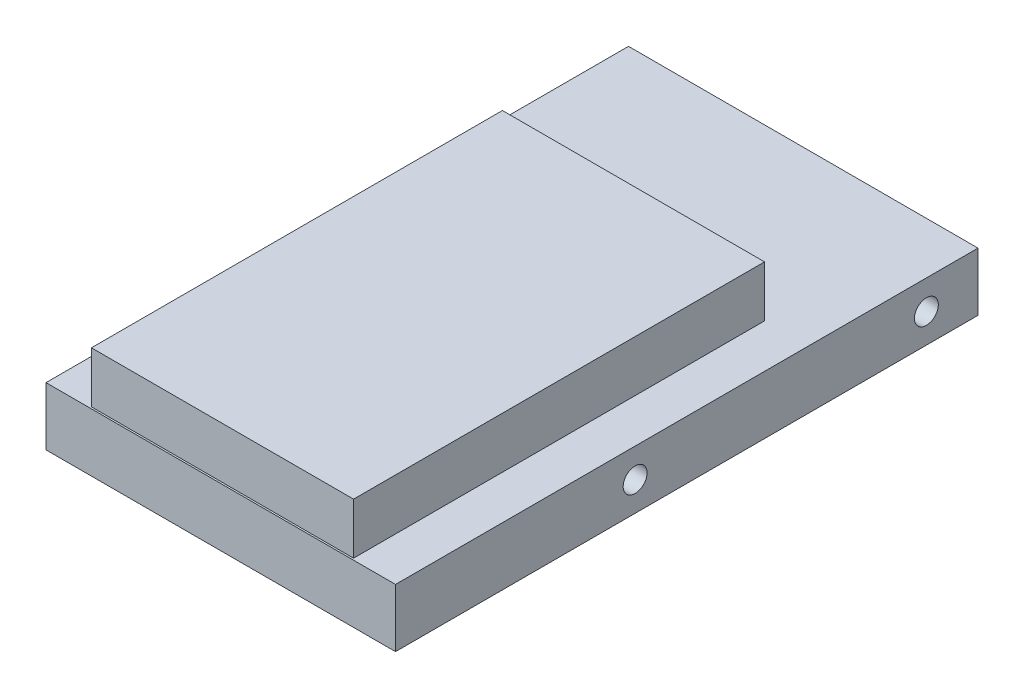
ISO-10303-21;
HEADER;
FILE_DESCRIPTION(('STEP AP214'),'2;1');
FILE_NAME('part.step','',(''),(''),'','','');
FILE_SCHEMA(('AUTOMOTIVE_DESIGN { 1 0 10303 214 1 1 1 1 }'));
ENDSEC;
DATA;
#1=APPLICATION_CONTEXT('core data for automotive mechanical design processes');
#2=APPLICATION_PROTOCOL_DEFINITION('international standard','automotive_design',2000,#1);
#3=PRODUCT_CONTEXT('',#1,'mechanical');
#4=PRODUCT('Part','Part','',(#3));
#5=PRODUCT_RELATED_PRODUCT_CATEGORY('part','',(#4));
#6=PRODUCT_DEFINITION_FORMATION('','',#4);
#7=PRODUCT_DEFINITION_CONTEXT('part definition',#1,'design');
#8=PRODUCT_DEFINITION('design','',#6,#7);
#9=PRODUCT_DEFINITION_SHAPE('','',#8);
#10=(LENGTH_UNIT() NAMED_UNIT(*) SI_UNIT(.MILLI.,.METRE.));
#11=(NAMED_UNIT(*) PLANE_ANGLE_UNIT() SI_UNIT($,.RADIAN.));
#12=(NAMED_UNIT(*) SI_UNIT($,.STERADIAN.) SOLID_ANGLE_UNIT());
#13=UNCERTAINTY_MEASURE_WITH_UNIT(LENGTH_MEASURE(1.E-05),#10,'distance_accuracy_value','');
#14=(GEOMETRIC_REPRESENTATION_CONTEXT(3) GLOBAL_UNCERTAINTY_ASSIGNED_CONTEXT((#13)) GLOBAL_UNIT_ASSIGNED_CONTEXT((#10,
#11,#12)) REPRESENTATION_CONTEXT('',''));
#15=CARTESIAN_POINT('',(0.,0.,0.));
#16=DIRECTION('',(0.,0.,1.));
#17=DIRECTION('',(1.,0.,0.));
#18=AXIS2_PLACEMENT_3D('',#15,#16,#17);
#19=CARTESIAN_POINT('',(30.,10.,0.));
#20=DIRECTION('',(0.,-1.,0.));
#21=DIRECTION('',(0.,0.,-1.));
#22=AXIS2_PLACEMENT_3D('',#19,#20,#21);
#23=PLANE('',#22);
#24=DIRECTION('',(0.,0.,1.));
#25=VECTOR('',#24,1.);
#26=CARTESIAN_POINT('',(-30.,10.,0.));
#27=LINE('',#26,#25);
#28=CARTESIAN_POINT('',(-30.,10.,-100.));
#29=VERTEX_POINT('',#28);
#30=CARTESIAN_POINT('',(-30.,10.,0.));
#31=VERTEX_POINT('',#30);
#32=EDGE_CURVE('E78',#29,#31,#27,.T.);
#33=ORIENTED_EDGE('',*,*,#32,.T.);
#34=DIRECTION('',(-1.,0.,0.));
#35=VECTOR('',#34,1.);
#36=CARTESIAN_POINT('',(30.,10.,0.));
#37=LINE('',#36,#35);
#38=CARTESIAN_POINT('',(30.,10.,0.));
#39=VERTEX_POINT('',#38);
#40=EDGE_CURVE('E165',#39,#31,#37,.T.);
#41=ORIENTED_EDGE('',*,*,#40,.F.);
#42=DIRECTION('',(0.,0.,1.));
#43=VECTOR('',#42,1.);
#44=CARTESIAN_POINT('',(30.,10.,0.));
#45=LINE('',#44,#43);
#46=CARTESIAN_POINT('',(30.,10.,-100.));
#47=VERTEX_POINT('',#46);
#48=EDGE_CURVE('E57',#47,#39,#45,.T.);
#49=ORIENTED_EDGE('',*,*,#48,.F.);
#50=DIRECTION('',(-1.,0.,0.));
#51=VECTOR('',#50,1.);
#52=CARTESIAN_POINT('',(30.,10.,-100.));
#53=LINE('',#52,#51);
#54=EDGE_CURVE('E174',#47,#29,#53,.T.);
#55=ORIENTED_EDGE('',*,*,#54,.T.);
#56=EDGE_LOOP('',(#33,#41,#49,#55));
#57=FACE_BOUND('',#56,.T.);
#58=DIRECTION('',(0.,0.,-1.));
#59=VECTOR('',#58,1.);
#60=CARTESIAN_POINT('',(22.5,10.,-0.300388826904058));
#61=LINE('',#60,#59);
#62=CARTESIAN_POINT('',(22.5,10.,-0.300388826904058));
#63=VERTEX_POINT('',#62);
#64=CARTESIAN_POINT('',(22.5,10.,-70.8527289797882));
#65=VERTEX_POINT('',#64);
#66=EDGE_CURVE('E110',#63,#65,#61,.T.);
#67=ORIENTED_EDGE('',*,*,#66,.F.);
#68=DIRECTION('',(-1.,0.,0.));
#69=VECTOR('',#68,1.);
#70=CARTESIAN_POINT('',(22.5,10.,-0.300388826904058));
#71=LINE('',#70,#69);
#72=CARTESIAN_POINT('',(-22.5,10.,-0.300388826904058));
#73=VERTEX_POINT('',#72);
#74=EDGE_CURVE('E121',#63,#73,#71,.T.);
#75=ORIENTED_EDGE('',*,*,#74,.T.);
#76=DIRECTION('',(0.,0.,-1.));
#77=VECTOR('',#76,1.);
#78=CARTESIAN_POINT('',(-22.5,10.,-0.300388826904058));
#79=LINE('',#78,#77);
#80=CARTESIAN_POINT('',(-22.5,10.,-70.8527289797882));
#81=VERTEX_POINT('',#80);
#82=EDGE_CURVE('E138',#73,#81,#79,.T.);
#83=ORIENTED_EDGE('',*,*,#82,.T.);
#84=DIRECTION('',(-1.,0.,0.));
#85=VECTOR('',#84,1.);
#86=CARTESIAN_POINT('',(22.5,10.,-70.8527289797882));
#87=LINE('',#86,#85);
#88=EDGE_CURVE('E128',#65,#81,#87,.T.);
#89=ORIENTED_EDGE('',*,*,#88,.F.);
#90=EDGE_LOOP('',(#67,#75,#83,#89));
#91=FACE_BOUND('',#90,.T.);
#92=ADVANCED_FACE('F33',(#57,#91),#23,.F.);
#93=CARTESIAN_POINT('',(30.,0.,0.));
#94=DIRECTION('',(0.,0.,-1.));
#95=DIRECTION('',(-1.,0.,0.));
#96=AXIS2_PLACEMENT_3D('',#93,#94,#95);
#97=PLANE('',#96);
#98=DIRECTION('',(0.,-1.,0.));
#99=VECTOR('',#98,1.);
#100=CARTESIAN_POINT('',(-30.,0.,0.));
#101=LINE('',#100,#99);
#102=CARTESIAN_POINT('',(-30.,0.,0.));
#103=VERTEX_POINT('',#102);
#104=EDGE_CURVE('E158',#31,#103,#101,.T.);
#105=ORIENTED_EDGE('',*,*,#104,.T.);
#106=DIRECTION('',(-1.,0.,0.));
#107=VECTOR('',#106,1.);
#108=CARTESIAN_POINT('',(30.,0.,0.));
#109=LINE('',#108,#107);
#110=CARTESIAN_POINT('',(30.,0.,0.));
#111=VERTEX_POINT('',#110);
#112=EDGE_CURVE('E11',#111,#103,#109,.T.);
#113=ORIENTED_EDGE('',*,*,#112,.F.);
#114=DIRECTION('',(0.,-1.,0.));
#115=VECTOR('',#114,1.);
#116=CARTESIAN_POINT('',(30.,0.,0.));
#117=LINE('',#116,#115);
#118=EDGE_CURVE('E159',#39,#111,#117,.T.);
#119=ORIENTED_EDGE('',*,*,#118,.F.);
#120=ORIENTED_EDGE('',*,*,#40,.T.);
#121=EDGE_LOOP('',(#105,#113,#119,#120));
#122=FACE_BOUND('',#121,.T.);
#123=ADVANCED_FACE('F35',(#122),#97,.F.);
#124=CARTESIAN_POINT('',(30.,0.,0.));
#125=DIRECTION('',(0.,1.,0.));
#126=DIRECTION('',(0.,0.,1.));
#127=AXIS2_PLACEMENT_3D('',#124,#125,#126);
#128=PLANE('',#127);
#129=DIRECTION('',(0.,0.,-1.));
#130=VECTOR('',#129,1.);
#131=CARTESIAN_POINT('',(-30.,0.,0.));
#132=LINE('',#131,#130);
#133=CARTESIAN_POINT('',(-30.,0.,-100.));
#134=VERTEX_POINT('',#133);
#135=EDGE_CURVE('E168',#103,#134,#132,.T.);
#136=ORIENTED_EDGE('',*,*,#135,.T.);
#137=DIRECTION('',(-1.,0.,0.));
#138=VECTOR('',#137,1.);
#139=CARTESIAN_POINT('',(30.,0.,-100.));
#140=LINE('',#139,#138);
#141=CARTESIAN_POINT('',(30.,0.,-100.));
#142=VERTEX_POINT('',#141);
#143=EDGE_CURVE('E41',#142,#134,#140,.T.);
#144=ORIENTED_EDGE('',*,*,#143,.F.);
#145=DIRECTION('',(0.,0.,-1.));
#146=VECTOR('',#145,1.);
#147=CARTESIAN_POINT('',(30.,0.,0.));
#148=LINE('',#147,#146);
#149=EDGE_CURVE('E85',#111,#142,#148,.T.);
#150=ORIENTED_EDGE('',*,*,#149,.F.);
#151=ORIENTED_EDGE('',*,*,#112,.T.);
#152=EDGE_LOOP('',(#136,#144,#150,#151));
#153=FACE_BOUND('',#152,.T.);
#154=ADVANCED_FACE('F192',(#153),#128,.F.);
#155=CARTESIAN_POINT('',(30.,0.,-100.));
#156=DIRECTION('',(0.,0.,1.));
#157=DIRECTION('',(1.,0.,0.));
#158=AXIS2_PLACEMENT_3D('',#155,#156,#157);
#159=PLANE('',#158);
#160=DIRECTION('',(0.,1.,0.));
#161=VECTOR('',#160,1.);
#162=CARTESIAN_POINT('',(-30.,0.,-100.));
#163=LINE('',#162,#161);
#164=EDGE_CURVE('E170',#134,#29,#163,.T.);
#165=ORIENTED_EDGE('',*,*,#164,.T.);
#166=ORIENTED_EDGE('',*,*,#54,.F.);
#167=DIRECTION('',(0.,1.,0.));
#168=VECTOR('',#167,1.);
#169=CARTESIAN_POINT('',(30.,0.,-100.));
#170=LINE('',#169,#168);
#171=EDGE_CURVE('E162',#142,#47,#170,.T.);
#172=ORIENTED_EDGE('',*,*,#171,.F.);
#173=ORIENTED_EDGE('',*,*,#143,.T.);
#174=EDGE_LOOP('',(#165,#166,#172,#173));
#175=FACE_BOUND('',#174,.T.);
#176=ADVANCED_FACE('F179',(#175),#159,.F.);
#177=CARTESIAN_POINT('',(30.,0.,0.));
#178=DIRECTION('',(-1.,0.,0.));
#179=DIRECTION('',(0.,0.,1.));
#180=AXIS2_PLACEMENT_3D('',#177,#178,#179);
#181=PLANE('',#180);
#182=CARTESIAN_POINT('',(30.,5.,-91.1379551694327));
#183=DIRECTION('',(1.,0.,0.));
#184=DIRECTION('',(0.,0.,-1.));
#185=AXIS2_PLACEMENT_3D('',#182,#183,#184);
#186=CIRCLE('',#185,2.04999999999999);
#187=CARTESIAN_POINT('',(30.,5.,-93.1879551694327));
#188=VERTEX_POINT('',#187);
#189=EDGE_CURVE('E127',#188,#188,#186,.T.);
#190=ORIENTED_EDGE('',*,*,#189,.F.);
#191=EDGE_LOOP('',(#190));
#192=FACE_BOUND('',#191,.T.);
#193=CARTESIAN_POINT('',(30.,5.,-41.1379551694327));
#194=DIRECTION('',(1.,0.,0.));
#195=DIRECTION('',(0.,0.,-1.));
#196=AXIS2_PLACEMENT_3D('',#193,#194,#195);
#197=CIRCLE('',#196,2.05);
#198=CARTESIAN_POINT('',(30.,5.,-43.1879551694327));
#199=VERTEX_POINT('',#198);
#200=EDGE_CURVE('E152',#199,#199,#197,.T.);
#201=ORIENTED_EDGE('',*,*,#200,.F.);
#202=EDGE_LOOP('',(#201));
#203=FACE_BOUND('',#202,.T.);
#204=ORIENTED_EDGE('',*,*,#118,.T.);
#205=ORIENTED_EDGE('',*,*,#149,.T.);
#206=ORIENTED_EDGE('',*,*,#171,.T.);
#207=ORIENTED_EDGE('',*,*,#48,.T.);
#208=EDGE_LOOP('',(#204,#205,#206,#207));
#209=FACE_BOUND('',#208,.T.);
#210=ADVANCED_FACE('F197',(#192,#203,#209),#181,.F.);
#211=CARTESIAN_POINT('',(-30.,0.,0.));
#212=DIRECTION('',(-1.,0.,0.));
#213=DIRECTION('',(0.,0.,1.));
#214=AXIS2_PLACEMENT_3D('',#211,#212,#213);
#215=PLANE('',#214);
#216=CARTESIAN_POINT('',(-30.,5.,-91.1379551694327));
#217=DIRECTION('',(1.,0.,0.));
#218=DIRECTION('',(0.,0.,-1.));
#219=AXIS2_PLACEMENT_3D('',#216,#217,#218);
#220=CIRCLE('',#219,2.04999999999999);
#221=CARTESIAN_POINT('',(-30.,5.,-93.1879551694327));
#222=VERTEX_POINT('',#221);
#223=EDGE_CURVE('E149',#222,#222,#220,.T.);
#224=ORIENTED_EDGE('',*,*,#223,.T.);
#225=EDGE_LOOP('',(#224));
#226=FACE_BOUND('',#225,.T.);
#227=CARTESIAN_POINT('',(-30.,5.,-41.1379551694327));
#228=DIRECTION('',(1.,0.,0.));
#229=DIRECTION('',(0.,0.,-1.));
#230=AXIS2_PLACEMENT_3D('',#227,#228,#229);
#231=CIRCLE('',#230,2.05);
#232=CARTESIAN_POINT('',(-30.,5.,-43.1879551694327));
#233=VERTEX_POINT('',#232);
#234=EDGE_CURVE('E155',#233,#233,#231,.T.);
#235=ORIENTED_EDGE('',*,*,#234,.T.);
#236=EDGE_LOOP('',(#235));
#237=FACE_BOUND('',#236,.T.);
#238=ORIENTED_EDGE('',*,*,#104,.F.);
#239=ORIENTED_EDGE('',*,*,#32,.F.);
#240=ORIENTED_EDGE('',*,*,#164,.F.);
#241=ORIENTED_EDGE('',*,*,#135,.F.);
#242=EDGE_LOOP('',(#238,#239,#240,#241));
#243=FACE_BOUND('',#242,.T.);
#244=ADVANCED_FACE('F183',(#226,#237,#243),#215,.T.);
#245=CARTESIAN_POINT('',(-30.,5.,-41.1379551694327));
#246=DIRECTION('',(1.,0.,0.));
#247=DIRECTION('',(0.,0.,-1.));
#248=AXIS2_PLACEMENT_3D('',#245,#246,#247);
#249=CYLINDRICAL_SURFACE('',#248,2.05);
#250=ORIENTED_EDGE('',*,*,#234,.F.);
#251=EDGE_LOOP('',(#250));
#252=FACE_BOUND('',#251,.T.);
#253=ORIENTED_EDGE('',*,*,#200,.T.);
#254=EDGE_LOOP('',(#253));
#255=FACE_BOUND('',#254,.T.);
#256=ADVANCED_FACE('F219',(#252,#255),#249,.F.);
#257=CARTESIAN_POINT('',(-30.,5.,-91.1379551694327));
#258=DIRECTION('',(1.,0.,0.));
#259=DIRECTION('',(0.,0.,-1.));
#260=AXIS2_PLACEMENT_3D('',#257,#258,#259);
#261=CYLINDRICAL_SURFACE('',#260,2.04999999999999);
#262=ORIENTED_EDGE('',*,*,#223,.F.);
#263=EDGE_LOOP('',(#262));
#264=FACE_BOUND('',#263,.T.);
#265=ORIENTED_EDGE('',*,*,#189,.T.);
#266=EDGE_LOOP('',(#265));
#267=FACE_BOUND('',#266,.T.);
#268=ADVANCED_FACE('F226',(#264,#267),#261,.F.);
#269=CARTESIAN_POINT('',(22.5,10.,-0.300388826904058));
#270=DIRECTION('',(0.,0.,-1.));
#271=DIRECTION('',(-1.,0.,0.));
#272=AXIS2_PLACEMENT_3D('',#269,#270,#271);
#273=PLANE('',#272);
#274=DIRECTION('',(0.,-1.,0.));
#275=VECTOR('',#274,1.);
#276=CARTESIAN_POINT('',(-22.5,10.,-0.300388826904058));
#277=LINE('',#276,#275);
#278=CARTESIAN_POINT('',(-22.5,18.7793989743577,-0.300388826904058));
#279=VERTEX_POINT('',#278);
#280=EDGE_CURVE('E124',#279,#73,#277,.T.);
#281=ORIENTED_EDGE('',*,*,#280,.T.);
#282=ORIENTED_EDGE('',*,*,#74,.F.);
#283=DIRECTION('',(0.,-1.,0.));
#284=VECTOR('',#283,1.);
#285=CARTESIAN_POINT('',(22.5,10.,-0.300388826904058));
#286=LINE('',#285,#284);
#287=CARTESIAN_POINT('',(22.5,18.7793989743577,-0.300388826904058));
#288=VERTEX_POINT('',#287);
#289=EDGE_CURVE('E106',#288,#63,#286,.T.);
#290=ORIENTED_EDGE('',*,*,#289,.F.);
#291=DIRECTION('',(-1.,0.,0.));
#292=VECTOR('',#291,1.);
#293=CARTESIAN_POINT('',(22.5,18.7793989743577,-0.300388826904058));
#294=LINE('',#293,#292);
#295=EDGE_CURVE('E136',#288,#279,#294,.T.);
#296=ORIENTED_EDGE('',*,*,#295,.T.);
#297=EDGE_LOOP('',(#281,#282,#290,#296));
#298=FACE_BOUND('',#297,.T.);
#299=ADVANCED_FACE('F122',(#298),#273,.F.);
#300=CARTESIAN_POINT('',(22.5,10.,-70.8527289797882));
#301=DIRECTION('',(0.,0.,1.));
#302=DIRECTION('',(1.,0.,0.));
#303=AXIS2_PLACEMENT_3D('',#300,#301,#302);
#304=PLANE('',#303);
#305=DIRECTION('',(0.,1.,0.));
#306=VECTOR('',#305,1.);
#307=CARTESIAN_POINT('',(-22.5,10.,-70.8527289797882));
#308=LINE('',#307,#306);
#309=CARTESIAN_POINT('',(-22.5,18.7793989743577,-70.8527289797882));
#310=VERTEX_POINT('',#309);
#311=EDGE_CURVE('E48',#81,#310,#308,.T.);
#312=ORIENTED_EDGE('',*,*,#311,.T.);
#313=DIRECTION('',(-1.,0.,0.));
#314=VECTOR('',#313,1.);
#315=CARTESIAN_POINT('',(22.5,18.7793989743577,-70.8527289797882));
#316=LINE('',#315,#314);
#317=CARTESIAN_POINT('',(22.5,18.7793989743577,-70.8527289797882));
#318=VERTEX_POINT('',#317);
#319=EDGE_CURVE('E143',#318,#310,#316,.T.);
#320=ORIENTED_EDGE('',*,*,#319,.F.);
#321=DIRECTION('',(0.,1.,0.));
#322=VECTOR('',#321,1.);
#323=CARTESIAN_POINT('',(22.5,10.,-70.8527289797882));
#324=LINE('',#323,#322);
#325=EDGE_CURVE('E131',#65,#318,#324,.T.);
#326=ORIENTED_EDGE('',*,*,#325,.F.);
#327=ORIENTED_EDGE('',*,*,#88,.T.);
#328=EDGE_LOOP('',(#312,#320,#326,#327));
#329=FACE_BOUND('',#328,.T.);
#330=ADVANCED_FACE('F241',(#329),#304,.F.);
#331=CARTESIAN_POINT('',(22.5,18.7793989743577,-0.300388826904058));
#332=DIRECTION('',(0.,-1.,0.));
#333=DIRECTION('',(0.,0.,-1.));
#334=AXIS2_PLACEMENT_3D('',#331,#332,#333);
#335=PLANE('',#334);
#336=DIRECTION('',(0.,0.,1.));
#337=VECTOR('',#336,1.);
#338=CARTESIAN_POINT('',(-22.5,18.7793989743577,-0.300388826904058));
#339=LINE('',#338,#337);
#340=EDGE_CURVE('E117',#310,#279,#339,.T.);
#341=ORIENTED_EDGE('',*,*,#340,.T.);
#342=ORIENTED_EDGE('',*,*,#295,.F.);
#343=DIRECTION('',(0.,0.,1.));
#344=VECTOR('',#343,1.);
#345=CARTESIAN_POINT('',(22.5,18.7793989743577,-0.300388826904058));
#346=LINE('',#345,#344);
#347=EDGE_CURVE('E113',#318,#288,#346,.T.);
#348=ORIENTED_EDGE('',*,*,#347,.F.);
#349=ORIENTED_EDGE('',*,*,#319,.T.);
#350=EDGE_LOOP('',(#341,#342,#348,#349));
#351=FACE_BOUND('',#350,.T.);
#352=ADVANCED_FACE('F248',(#351),#335,.F.);
#353=CARTESIAN_POINT('',(22.5,0.,0.));
#354=DIRECTION('',(-1.,0.,0.));
#355=DIRECTION('',(0.,0.,1.));
#356=AXIS2_PLACEMENT_3D('',#353,#354,#355);
#357=PLANE('',#356);
#358=ORIENTED_EDGE('',*,*,#289,.T.);
#359=ORIENTED_EDGE('',*,*,#66,.T.);
#360=ORIENTED_EDGE('',*,*,#325,.T.);
#361=ORIENTED_EDGE('',*,*,#347,.T.);
#362=EDGE_LOOP('',(#358,#359,#360,#361));
#363=FACE_BOUND('',#362,.T.);
#364=ADVANCED_FACE('F108',(#363),#357,.F.);
#365=CARTESIAN_POINT('',(-22.5,0.,0.));
#366=DIRECTION('',(-1.,0.,0.));
#367=DIRECTION('',(0.,0.,1.));
#368=AXIS2_PLACEMENT_3D('',#365,#366,#367);
#369=PLANE('',#368);
#370=ORIENTED_EDGE('',*,*,#280,.F.);
#371=ORIENTED_EDGE('',*,*,#340,.F.);
#372=ORIENTED_EDGE('',*,*,#311,.F.);
#373=ORIENTED_EDGE('',*,*,#82,.F.);
#374=EDGE_LOOP('',(#370,#371,#372,#373));
#375=FACE_BOUND('',#374,.T.);
#376=ADVANCED_FACE('F263',(#375),#369,.T.);
#377=CLOSED_SHELL('',(#92,#123,#154,#176,#210,#244,#256,#268,#299,#330,#352,#364,#376));
#378=MANIFOLD_SOLID_BREP('B2',#377);
#379=ADVANCED_BREP_SHAPE_REPRESENTATION('',(#18,#378),#14);
#380=SHAPE_DEFINITION_REPRESENTATION(#9,#379);
ENDSEC;
END-ISO-10303-21;
